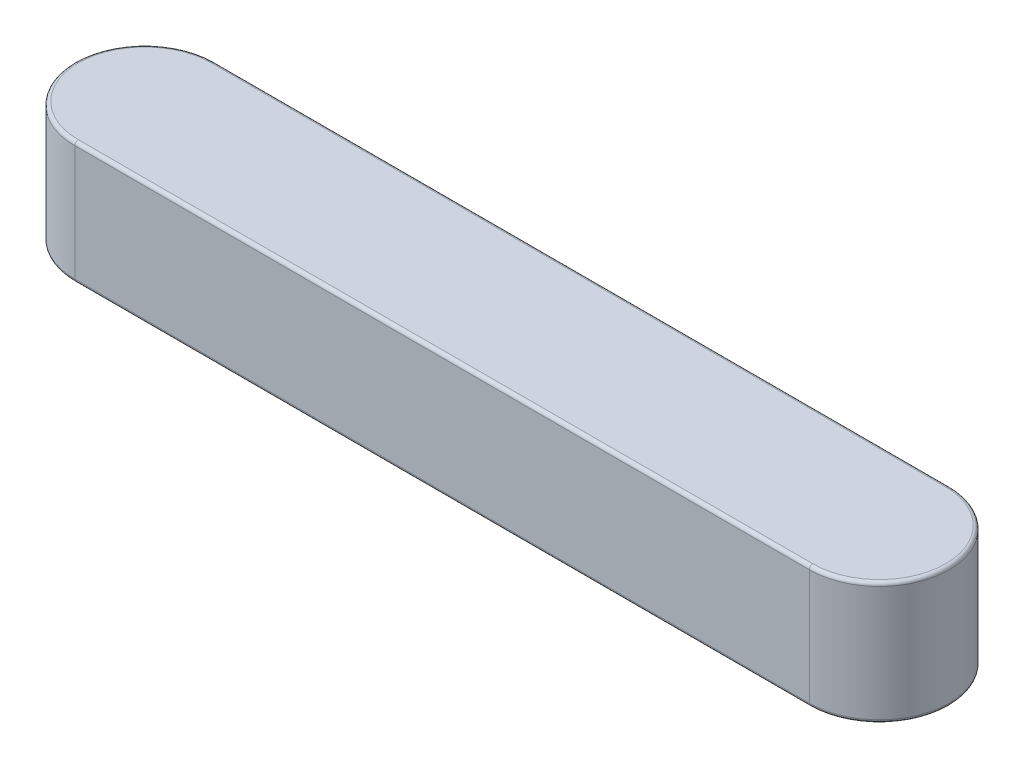
ISO-10303-21;
HEADER;
FILE_DESCRIPTION(('STEP AP214'),'2;1');
FILE_NAME('part.step','',(''),(''),'','','');
FILE_SCHEMA(('AUTOMOTIVE_DESIGN { 1 0 10303 214 1 1 1 1 }'));
ENDSEC;
DATA;
#1=APPLICATION_CONTEXT('core data for automotive mechanical design processes');
#2=APPLICATION_PROTOCOL_DEFINITION('international standard','automotive_design',2000,#1);
#3=PRODUCT_CONTEXT('',#1,'mechanical');
#4=PRODUCT('Part','Part','',(#3));
#5=PRODUCT_RELATED_PRODUCT_CATEGORY('part','',(#4));
#6=PRODUCT_DEFINITION_FORMATION('','',#4);
#7=PRODUCT_DEFINITION_CONTEXT('part definition',#1,'design');
#8=PRODUCT_DEFINITION('design','',#6,#7);
#9=PRODUCT_DEFINITION_SHAPE('','',#8);
#10=(LENGTH_UNIT() NAMED_UNIT(*) SI_UNIT(.MILLI.,.METRE.));
#11=(NAMED_UNIT(*) PLANE_ANGLE_UNIT() SI_UNIT($,.RADIAN.));
#12=(NAMED_UNIT(*) SI_UNIT($,.STERADIAN.) SOLID_ANGLE_UNIT());
#13=UNCERTAINTY_MEASURE_WITH_UNIT(LENGTH_MEASURE(1.E-05),#10,'distance_accuracy_value','');
#14=(GEOMETRIC_REPRESENTATION_CONTEXT(3) GLOBAL_UNCERTAINTY_ASSIGNED_CONTEXT((#13)) GLOBAL_UNIT_ASSIGNED_CONTEXT((#10,
#11,#12)) REPRESENTATION_CONTEXT('',''));
#15=CARTESIAN_POINT('',(0.,0.,0.));
#16=DIRECTION('',(0.,0.,1.));
#17=DIRECTION('',(1.,0.,0.));
#18=AXIS2_PLACEMENT_3D('',#15,#16,#17);
#19=CARTESIAN_POINT('',(-21.,7.,0.));
#20=DIRECTION('',(0.,1.,0.));
#21=DIRECTION('',(0.,0.,1.));
#22=AXIS2_PLACEMENT_3D('',#19,#20,#21);
#23=PLANE('',#22);
#24=CARTESIAN_POINT('',(-21.,7.,0.));
#25=DIRECTION('',(0.,-1.,0.));
#26=DIRECTION('',(0.,0.,1.));
#27=AXIS2_PLACEMENT_3D('',#24,#25,#26);
#28=CIRCLE('',#27,3.8);
#29=CARTESIAN_POINT('',(-21.,7.,3.8));
#30=VERTEX_POINT('',#29);
#31=CARTESIAN_POINT('',(-21.,7.,-3.8));
#32=VERTEX_POINT('',#31);
#33=EDGE_CURVE('E95',#30,#32,#28,.T.);
#34=ORIENTED_EDGE('',*,*,#33,.F.);
#35=DIRECTION('',(-1.,0.,0.));
#36=VECTOR('',#35,1.);
#37=CARTESIAN_POINT('',(-21.,7.,3.8));
#38=LINE('',#37,#36);
#39=CARTESIAN_POINT('',(21.,7.,3.8));
#40=VERTEX_POINT('',#39);
#41=EDGE_CURVE('E82',#40,#30,#38,.T.);
#42=ORIENTED_EDGE('',*,*,#41,.F.);
#43=CARTESIAN_POINT('',(21.,7.,0.));
#44=DIRECTION('',(0.,-1.,0.));
#45=DIRECTION('',(0.,0.,-1.));
#46=AXIS2_PLACEMENT_3D('',#43,#44,#45);
#47=CIRCLE('',#46,3.8);
#48=CARTESIAN_POINT('',(21.,7.,-3.8));
#49=VERTEX_POINT('',#48);
#50=EDGE_CURVE('E169',#49,#40,#47,.T.);
#51=ORIENTED_EDGE('',*,*,#50,.F.);
#52=DIRECTION('',(1.,0.,0.));
#53=VECTOR('',#52,1.);
#54=CARTESIAN_POINT('',(-21.,7.,-3.8));
#55=LINE('',#54,#53);
#56=EDGE_CURVE('E100',#32,#49,#55,.T.);
#57=ORIENTED_EDGE('',*,*,#56,.F.);
#58=EDGE_LOOP('',(#34,#42,#51,#57));
#59=FACE_BOUND('',#58,.T.);
#60=ADVANCED_FACE('F17',(#59),#23,.T.);
#61=CARTESIAN_POINT('',(-21.,6.8,3.8));
#62=DIRECTION('',(-1.,0.,0.));
#63=DIRECTION('',(0.,0.,1.));
#64=AXIS2_PLACEMENT_3D('',#61,#62,#63);
#65=CYLINDRICAL_SURFACE('',#64,0.2);
#66=CARTESIAN_POINT('',(21.,6.8,3.8));
#67=DIRECTION('',(1.,0.,0.));
#68=DIRECTION('',(0.,0.,1.));
#69=AXIS2_PLACEMENT_3D('',#66,#67,#68);
#70=CIRCLE('',#69,0.2);
#71=CARTESIAN_POINT('',(21.,6.8,4.));
#72=VERTEX_POINT('',#71);
#73=EDGE_CURVE('E88',#40,#72,#70,.T.);
#74=ORIENTED_EDGE('',*,*,#73,.F.);
#75=ORIENTED_EDGE('',*,*,#41,.T.);
#76=CARTESIAN_POINT('',(-21.,6.8,3.8));
#77=DIRECTION('',(1.,0.,0.));
#78=DIRECTION('',(0.,0.,1.));
#79=AXIS2_PLACEMENT_3D('',#76,#77,#78);
#80=CIRCLE('',#79,0.2);
#81=CARTESIAN_POINT('',(-21.,6.8,4.));
#82=VERTEX_POINT('',#81);
#83=EDGE_CURVE('E86',#82,#30,#80,.F.);
#84=ORIENTED_EDGE('',*,*,#83,.F.);
#85=DIRECTION('',(-1.,0.,0.));
#86=VECTOR('',#85,1.);
#87=CARTESIAN_POINT('',(-21.,6.8,4.));
#88=LINE('',#87,#86);
#89=EDGE_CURVE('E141',#82,#72,#88,.F.);
#90=ORIENTED_EDGE('',*,*,#89,.T.);
#91=EDGE_LOOP('',(#74,#75,#84,#90));
#92=FACE_BOUND('',#91,.T.);
#93=ADVANCED_FACE('F84',(#92),#65,.T.);
#94=CARTESIAN_POINT('',(21.,6.8,0.));
#95=DIRECTION('',(0.,1.,0.));
#96=DIRECTION('',(0.,0.,1.));
#97=AXIS2_PLACEMENT_3D('',#94,#95,#96);
#98=TOROIDAL_SURFACE('',#97,3.8,0.2);
#99=CARTESIAN_POINT('',(21.,6.8,-3.8));
#100=DIRECTION('',(1.,0.,0.));
#101=DIRECTION('',(0.,0.,-1.));
#102=AXIS2_PLACEMENT_3D('',#99,#100,#101);
#103=CIRCLE('',#102,0.2);
#104=CARTESIAN_POINT('',(21.,6.8,-4.));
#105=VERTEX_POINT('',#104);
#106=EDGE_CURVE('E167',#49,#105,#103,.F.);
#107=ORIENTED_EDGE('',*,*,#106,.F.);
#108=ORIENTED_EDGE('',*,*,#50,.T.);
#109=ORIENTED_EDGE('',*,*,#73,.T.);
#110=CARTESIAN_POINT('',(21.,6.8,0.));
#111=DIRECTION('',(0.,-1.,0.));
#112=DIRECTION('',(0.,0.,-1.));
#113=AXIS2_PLACEMENT_3D('',#110,#111,#112);
#114=CIRCLE('',#113,4.);
#115=EDGE_CURVE('E157',#105,#72,#114,.T.);
#116=ORIENTED_EDGE('',*,*,#115,.F.);
#117=EDGE_LOOP('',(#107,#108,#109,#116));
#118=FACE_BOUND('',#117,.T.);
#119=ADVANCED_FACE('F175',(#118),#98,.T.);
#120=CARTESIAN_POINT('',(-21.,6.8,-3.8));
#121=DIRECTION('',(1.,0.,0.));
#122=DIRECTION('',(0.,0.,-1.));
#123=AXIS2_PLACEMENT_3D('',#120,#121,#122);
#124=CYLINDRICAL_SURFACE('',#123,0.2);
#125=CARTESIAN_POINT('',(-21.,6.8,-3.8));
#126=DIRECTION('',(-1.,0.,0.));
#127=DIRECTION('',(0.,0.,-1.));
#128=AXIS2_PLACEMENT_3D('',#125,#126,#127);
#129=CIRCLE('',#128,0.2);
#130=CARTESIAN_POINT('',(-21.,6.8,-4.));
#131=VERTEX_POINT('',#130);
#132=EDGE_CURVE('E105',#32,#131,#129,.T.);
#133=ORIENTED_EDGE('',*,*,#132,.F.);
#134=ORIENTED_EDGE('',*,*,#56,.T.);
#135=ORIENTED_EDGE('',*,*,#106,.T.);
#136=DIRECTION('',(1.,0.,0.));
#137=VECTOR('',#136,1.);
#138=CARTESIAN_POINT('',(-21.,6.8,-4.));
#139=LINE('',#138,#137);
#140=EDGE_CURVE('E153',#105,#131,#139,.F.);
#141=ORIENTED_EDGE('',*,*,#140,.T.);
#142=EDGE_LOOP('',(#133,#134,#135,#141));
#143=FACE_BOUND('',#142,.T.);
#144=ADVANCED_FACE('F134',(#143),#124,.T.);
#145=CARTESIAN_POINT('',(-21.,6.8,0.));
#146=DIRECTION('',(0.,1.,0.));
#147=DIRECTION('',(0.,0.,1.));
#148=AXIS2_PLACEMENT_3D('',#145,#146,#147);
#149=TOROIDAL_SURFACE('',#148,3.8,0.2);
#150=ORIENTED_EDGE('',*,*,#132,.T.);
#151=CARTESIAN_POINT('',(-21.,6.8,0.));
#152=DIRECTION('',(0.,-1.,0.));
#153=DIRECTION('',(0.,0.,-1.));
#154=AXIS2_PLACEMENT_3D('',#151,#152,#153);
#155=CIRCLE('',#154,4.);
#156=EDGE_CURVE('E99',#82,#131,#155,.T.);
#157=ORIENTED_EDGE('',*,*,#156,.F.);
#158=ORIENTED_EDGE('',*,*,#83,.T.);
#159=ORIENTED_EDGE('',*,*,#33,.T.);
#160=EDGE_LOOP('',(#150,#157,#158,#159));
#161=FACE_BOUND('',#160,.T.);
#162=ADVANCED_FACE('F94',(#161),#149,.T.);
#163=CARTESIAN_POINT('',(-21.,7.,4.));
#164=DIRECTION('',(0.,0.,-1.));
#165=DIRECTION('',(-1.,0.,0.));
#166=AXIS2_PLACEMENT_3D('',#163,#164,#165);
#167=PLANE('',#166);
#168=DIRECTION('',(1.,0.,0.));
#169=VECTOR('',#168,1.);
#170=CARTESIAN_POINT('',(-21.,0.2,4.));
#171=LINE('',#170,#169);
#172=CARTESIAN_POINT('',(21.,0.2,4.));
#173=VERTEX_POINT('',#172);
#174=CARTESIAN_POINT('',(-21.,0.2,4.));
#175=VERTEX_POINT('',#174);
#176=EDGE_CURVE('E149',#173,#175,#171,.F.);
#177=ORIENTED_EDGE('',*,*,#176,.F.);
#178=DIRECTION('',(0.,-1.,0.));
#179=VECTOR('',#178,1.);
#180=CARTESIAN_POINT('',(21.,7.,4.));
#181=LINE('',#180,#179);
#182=EDGE_CURVE('E143',#72,#173,#181,.T.);
#183=ORIENTED_EDGE('',*,*,#182,.F.);
#184=ORIENTED_EDGE('',*,*,#89,.F.);
#185=DIRECTION('',(0.,-1.,0.));
#186=VECTOR('',#185,1.);
#187=CARTESIAN_POINT('',(-21.,7.,4.));
#188=LINE('',#187,#186);
#189=EDGE_CURVE('E150',#175,#82,#188,.F.);
#190=ORIENTED_EDGE('',*,*,#189,.F.);
#191=EDGE_LOOP('',(#177,#183,#184,#190));
#192=FACE_BOUND('',#191,.T.);
#193=ADVANCED_FACE('F133',(#192),#167,.F.);
#194=CARTESIAN_POINT('',(21.,7.,0.));
#195=DIRECTION('',(0.,-1.,0.));
#196=DIRECTION('',(0.,0.,-1.));
#197=AXIS2_PLACEMENT_3D('',#194,#195,#196);
#198=CYLINDRICAL_SURFACE('',#197,4.);
#199=DIRECTION('',(0.,1.,0.));
#200=VECTOR('',#199,1.);
#201=CARTESIAN_POINT('',(21.,7.,-4.));
#202=LINE('',#201,#200);
#203=CARTESIAN_POINT('',(21.,0.2,-4.));
#204=VERTEX_POINT('',#203);
#205=EDGE_CURVE('E156',#204,#105,#202,.T.);
#206=ORIENTED_EDGE('',*,*,#205,.T.);
#207=ORIENTED_EDGE('',*,*,#115,.T.);
#208=ORIENTED_EDGE('',*,*,#182,.T.);
#209=CARTESIAN_POINT('',(21.,0.2,0.));
#210=DIRECTION('',(0.,1.,0.));
#211=DIRECTION('',(0.,0.,1.));
#212=AXIS2_PLACEMENT_3D('',#209,#210,#211);
#213=CIRCLE('',#212,4.);
#214=EDGE_CURVE('E252',#204,#173,#213,.F.);
#215=ORIENTED_EDGE('',*,*,#214,.F.);
#216=EDGE_LOOP('',(#206,#207,#208,#215));
#217=FACE_BOUND('',#216,.T.);
#218=ADVANCED_FACE('F306',(#217),#198,.T.);
#219=CARTESIAN_POINT('',(-21.,7.,-4.));
#220=DIRECTION('',(0.,0.,1.));
#221=DIRECTION('',(1.,0.,0.));
#222=AXIS2_PLACEMENT_3D('',#219,#220,#221);
#223=PLANE('',#222);
#224=DIRECTION('',(-1.,0.,0.));
#225=VECTOR('',#224,1.);
#226=CARTESIAN_POINT('',(-21.,0.2,-4.));
#227=LINE('',#226,#225);
#228=CARTESIAN_POINT('',(-21.,0.2,-4.));
#229=VERTEX_POINT('',#228);
#230=EDGE_CURVE('E248',#229,#204,#227,.F.);
#231=ORIENTED_EDGE('',*,*,#230,.F.);
#232=DIRECTION('',(0.,-1.,0.));
#233=VECTOR('',#232,1.);
#234=CARTESIAN_POINT('',(-21.,7.,-4.));
#235=LINE('',#234,#233);
#236=EDGE_CURVE('E284',#131,#229,#235,.T.);
#237=ORIENTED_EDGE('',*,*,#236,.F.);
#238=ORIENTED_EDGE('',*,*,#140,.F.);
#239=ORIENTED_EDGE('',*,*,#205,.F.);
#240=EDGE_LOOP('',(#231,#237,#238,#239));
#241=FACE_BOUND('',#240,.T.);
#242=ADVANCED_FACE('F317',(#241),#223,.F.);
#243=CARTESIAN_POINT('',(-21.,7.,0.));
#244=DIRECTION('',(0.,-1.,0.));
#245=DIRECTION('',(0.,0.,-1.));
#246=AXIS2_PLACEMENT_3D('',#243,#244,#245);
#247=CYLINDRICAL_SURFACE('',#246,4.);
#248=ORIENTED_EDGE('',*,*,#189,.T.);
#249=ORIENTED_EDGE('',*,*,#156,.T.);
#250=ORIENTED_EDGE('',*,*,#236,.T.);
#251=CARTESIAN_POINT('',(-21.,0.2,0.));
#252=DIRECTION('',(0.,1.,0.));
#253=DIRECTION('',(0.,0.,1.));
#254=AXIS2_PLACEMENT_3D('',#251,#252,#253);
#255=CIRCLE('',#254,4.);
#256=EDGE_CURVE('E243',#175,#229,#255,.F.);
#257=ORIENTED_EDGE('',*,*,#256,.F.);
#258=EDGE_LOOP('',(#248,#249,#250,#257));
#259=FACE_BOUND('',#258,.T.);
#260=ADVANCED_FACE('F321',(#259),#247,.T.);
#261=CARTESIAN_POINT('',(-21.,0.2,3.8));
#262=DIRECTION('',(1.,0.,0.));
#263=DIRECTION('',(0.,0.,-1.));
#264=AXIS2_PLACEMENT_3D('',#261,#262,#263);
#265=CYLINDRICAL_SURFACE('',#264,0.2);
#266=CARTESIAN_POINT('',(21.,0.2,3.8));
#267=DIRECTION('',(1.,0.,0.));
#268=DIRECTION('',(0.,0.,1.));
#269=AXIS2_PLACEMENT_3D('',#266,#267,#268);
#270=CIRCLE('',#269,0.2);
#271=CARTESIAN_POINT('',(21.,0.,3.8));
#272=VERTEX_POINT('',#271);
#273=EDGE_CURVE('E269',#173,#272,#270,.T.);
#274=ORIENTED_EDGE('',*,*,#273,.F.);
#275=ORIENTED_EDGE('',*,*,#176,.T.);
#276=CARTESIAN_POINT('',(-21.,0.2,3.8));
#277=DIRECTION('',(1.,0.,0.));
#278=DIRECTION('',(0.,0.,1.));
#279=AXIS2_PLACEMENT_3D('',#276,#277,#278);
#280=CIRCLE('',#279,0.2);
#281=CARTESIAN_POINT('',(-21.,0.,3.8));
#282=VERTEX_POINT('',#281);
#283=EDGE_CURVE('E246',#282,#175,#280,.F.);
#284=ORIENTED_EDGE('',*,*,#283,.F.);
#285=DIRECTION('',(1.,0.,0.));
#286=VECTOR('',#285,1.);
#287=CARTESIAN_POINT('',(-21.,0.,3.8));
#288=LINE('',#287,#286);
#289=EDGE_CURVE('E218',#282,#272,#288,.T.);
#290=ORIENTED_EDGE('',*,*,#289,.T.);
#291=EDGE_LOOP('',(#274,#275,#284,#290));
#292=FACE_BOUND('',#291,.T.);
#293=ADVANCED_FACE('F263',(#292),#265,.T.);
#294=CARTESIAN_POINT('',(21.,0.2,0.));
#295=DIRECTION('',(0.,1.,0.));
#296=DIRECTION('',(0.,0.,1.));
#297=AXIS2_PLACEMENT_3D('',#294,#295,#296);
#298=TOROIDAL_SURFACE('',#297,3.8,0.2);
#299=CARTESIAN_POINT('',(21.,0.2,-3.8));
#300=DIRECTION('',(-1.,0.,0.));
#301=DIRECTION('',(0.,0.,1.));
#302=AXIS2_PLACEMENT_3D('',#299,#300,#301);
#303=CIRCLE('',#302,0.2);
#304=CARTESIAN_POINT('',(21.,0.,-3.8));
#305=VERTEX_POINT('',#304);
#306=EDGE_CURVE('E225',#204,#305,#303,.T.);
#307=ORIENTED_EDGE('',*,*,#306,.F.);
#308=ORIENTED_EDGE('',*,*,#214,.T.);
#309=ORIENTED_EDGE('',*,*,#273,.T.);
#310=CARTESIAN_POINT('',(21.,0.,0.));
#311=DIRECTION('',(0.,1.,0.));
#312=DIRECTION('',(0.,0.,1.));
#313=AXIS2_PLACEMENT_3D('',#310,#311,#312);
#314=CIRCLE('',#313,3.8);
#315=EDGE_CURVE('E226',#272,#305,#314,.T.);
#316=ORIENTED_EDGE('',*,*,#315,.T.);
#317=EDGE_LOOP('',(#307,#308,#309,#316));
#318=FACE_BOUND('',#317,.T.);
#319=ADVANCED_FACE('F259',(#318),#298,.T.);
#320=CARTESIAN_POINT('',(-21.,0.2,-3.8));
#321=DIRECTION('',(-1.,0.,0.));
#322=DIRECTION('',(0.,0.,1.));
#323=AXIS2_PLACEMENT_3D('',#320,#321,#322);
#324=CYLINDRICAL_SURFACE('',#323,0.2);
#325=CARTESIAN_POINT('',(-21.,0.2,-3.8));
#326=DIRECTION('',(-1.,0.,0.));
#327=DIRECTION('',(0.,0.,-1.));
#328=AXIS2_PLACEMENT_3D('',#325,#326,#327);
#329=CIRCLE('',#328,0.2);
#330=CARTESIAN_POINT('',(-21.,0.,-3.8));
#331=VERTEX_POINT('',#330);
#332=EDGE_CURVE('E36',#229,#331,#329,.T.);
#333=ORIENTED_EDGE('',*,*,#332,.F.);
#334=ORIENTED_EDGE('',*,*,#230,.T.);
#335=ORIENTED_EDGE('',*,*,#306,.T.);
#336=DIRECTION('',(1.,0.,0.));
#337=VECTOR('',#336,1.);
#338=CARTESIAN_POINT('',(-21.,0.,-3.8));
#339=LINE('',#338,#337);
#340=EDGE_CURVE('E29',#305,#331,#339,.F.);
#341=ORIENTED_EDGE('',*,*,#340,.T.);
#342=EDGE_LOOP('',(#333,#334,#335,#341));
#343=FACE_BOUND('',#342,.T.);
#344=ADVANCED_FACE('F192',(#343),#324,.T.);
#345=CARTESIAN_POINT('',(-21.,0.2,0.));
#346=DIRECTION('',(0.,1.,0.));
#347=DIRECTION('',(0.,0.,1.));
#348=AXIS2_PLACEMENT_3D('',#345,#346,#347);
#349=TOROIDAL_SURFACE('',#348,3.8,0.2);
#350=ORIENTED_EDGE('',*,*,#332,.T.);
#351=CARTESIAN_POINT('',(-21.,0.,0.));
#352=DIRECTION('',(0.,1.,0.));
#353=DIRECTION('',(0.,0.,-1.));
#354=AXIS2_PLACEMENT_3D('',#351,#352,#353);
#355=CIRCLE('',#354,3.8);
#356=EDGE_CURVE('E11',#331,#282,#355,.T.);
#357=ORIENTED_EDGE('',*,*,#356,.T.);
#358=ORIENTED_EDGE('',*,*,#283,.T.);
#359=ORIENTED_EDGE('',*,*,#256,.T.);
#360=EDGE_LOOP('',(#350,#357,#358,#359));
#361=FACE_BOUND('',#360,.T.);
#362=ADVANCED_FACE('F186',(#361),#349,.T.);
#363=CARTESIAN_POINT('',(-21.,0.,0.));
#364=DIRECTION('',(0.,1.,0.));
#365=DIRECTION('',(0.,0.,1.));
#366=AXIS2_PLACEMENT_3D('',#363,#364,#365);
#367=PLANE('',#366);
#368=ORIENTED_EDGE('',*,*,#340,.F.);
#369=ORIENTED_EDGE('',*,*,#315,.F.);
#370=ORIENTED_EDGE('',*,*,#289,.F.);
#371=ORIENTED_EDGE('',*,*,#356,.F.);
#372=EDGE_LOOP('',(#368,#369,#370,#371));
#373=FACE_BOUND('',#372,.T.);
#374=ADVANCED_FACE('F184',(#373),#367,.F.);
#375=CLOSED_SHELL('',(#60,#93,#119,#144,#162,#193,#218,#242,#260,#293,#319,#344,#362,#374));
#376=MANIFOLD_SOLID_BREP('B1',#375);
#377=ADVANCED_BREP_SHAPE_REPRESENTATION('',(#18,#376),#14);
#378=SHAPE_DEFINITION_REPRESENTATION(#9,#377);
ENDSEC;
END-ISO-10303-21;
